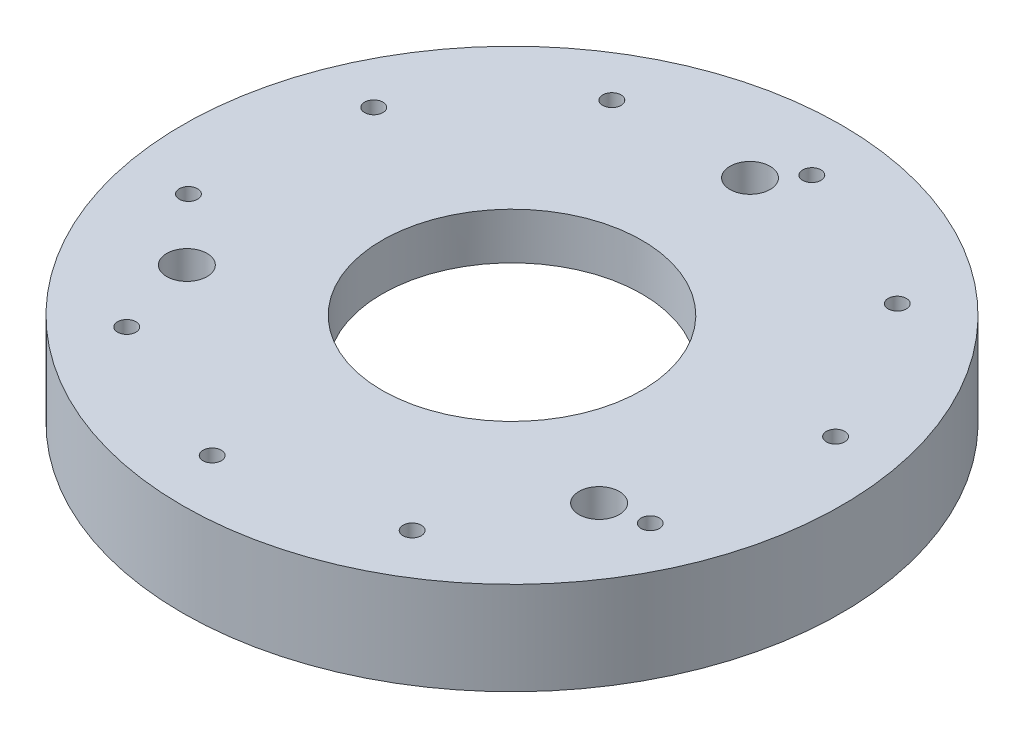
ISO-10303-21;
HEADER;
FILE_DESCRIPTION(('STEP AP214'),'2;1');
FILE_NAME('part.step','',(''),(''),'','','');
FILE_SCHEMA(('AUTOMOTIVE_DESIGN { 1 0 10303 214 1 1 1 1 }'));
ENDSEC;
DATA;
#1=APPLICATION_CONTEXT('core data for automotive mechanical design processes');
#2=APPLICATION_PROTOCOL_DEFINITION('international standard','automotive_design',2000,#1);
#3=PRODUCT_CONTEXT('',#1,'mechanical');
#4=PRODUCT('Part','Part','',(#3));
#5=PRODUCT_RELATED_PRODUCT_CATEGORY('part','',(#4));
#6=PRODUCT_DEFINITION_FORMATION('','',#4);
#7=PRODUCT_DEFINITION_CONTEXT('part definition',#1,'design');
#8=PRODUCT_DEFINITION('design','',#6,#7);
#9=PRODUCT_DEFINITION_SHAPE('','',#8);
#10=(LENGTH_UNIT() NAMED_UNIT(*) SI_UNIT(.MILLI.,.METRE.));
#11=(NAMED_UNIT(*) PLANE_ANGLE_UNIT() SI_UNIT($,.RADIAN.));
#12=(NAMED_UNIT(*) SI_UNIT($,.STERADIAN.) SOLID_ANGLE_UNIT());
#13=UNCERTAINTY_MEASURE_WITH_UNIT(LENGTH_MEASURE(1.E-05),#10,'distance_accuracy_value','');
#14=(GEOMETRIC_REPRESENTATION_CONTEXT(3) GLOBAL_UNCERTAINTY_ASSIGNED_CONTEXT((#13)) GLOBAL_UNIT_ASSIGNED_CONTEXT((#10,
#11,#12)) REPRESENTATION_CONTEXT('',''));
#15=CARTESIAN_POINT('',(0.,0.,0.));
#16=DIRECTION('',(0.,0.,1.));
#17=DIRECTION('',(1.,0.,0.));
#18=AXIS2_PLACEMENT_3D('',#15,#16,#17);
#19=CARTESIAN_POINT('',(0.,12.7,-32.5));
#20=DIRECTION('',(0.,-1.,0.));
#21=DIRECTION('',(0.,0.,-1.));
#22=AXIS2_PLACEMENT_3D('',#19,#20,#21);
#23=CYLINDRICAL_SURFACE('',#22,2.75);
#24=CARTESIAN_POINT('',(0.,12.7,-32.5));
#25=DIRECTION('',(0.,1.,0.));
#26=DIRECTION('',(0.,0.,1.));
#27=AXIS2_PLACEMENT_3D('',#24,#25,#26);
#28=CIRCLE('',#27,2.75);
#29=CARTESIAN_POINT('',(0.,12.7,-29.75));
#30=VERTEX_POINT('',#29);
#31=EDGE_CURVE('E224',#30,#30,#28,.T.);
#32=ORIENTED_EDGE('',*,*,#31,.T.);
#33=EDGE_LOOP('',(#32));
#34=FACE_BOUND('',#33,.T.);
#35=CARTESIAN_POINT('',(0.,6.35,-32.5));
#36=DIRECTION('',(0.,-1.,0.));
#37=DIRECTION('',(0.,0.,-1.));
#38=AXIS2_PLACEMENT_3D('',#35,#36,#37);
#39=CIRCLE('',#38,2.75);
#40=CARTESIAN_POINT('',(0.,6.35,-35.25));
#41=VERTEX_POINT('',#40);
#42=EDGE_CURVE('E127',#41,#41,#39,.T.);
#43=ORIENTED_EDGE('',*,*,#42,.T.);
#44=EDGE_LOOP('',(#43));
#45=FACE_BOUND('',#44,.T.);
#46=ADVANCED_FACE('F44',(#34,#45),#23,.F.);
#47=CARTESIAN_POINT('',(28.1458256229943,12.7,16.25));
#48=DIRECTION('',(0.,-1.,0.));
#49=DIRECTION('',(0.,0.,-1.));
#50=AXIS2_PLACEMENT_3D('',#47,#48,#49);
#51=CYLINDRICAL_SURFACE('',#50,2.75);
#52=CARTESIAN_POINT('',(28.1458256229943,12.7,16.25));
#53=DIRECTION('',(0.,1.,0.));
#54=DIRECTION('',(0.,0.,1.));
#55=AXIS2_PLACEMENT_3D('',#52,#53,#54);
#56=CIRCLE('',#55,2.75);
#57=CARTESIAN_POINT('',(28.1458256229943,12.7,19.));
#58=VERTEX_POINT('',#57);
#59=EDGE_CURVE('E214',#58,#58,#56,.T.);
#60=ORIENTED_EDGE('',*,*,#59,.T.);
#61=EDGE_LOOP('',(#60));
#62=FACE_BOUND('',#61,.T.);
#63=CARTESIAN_POINT('',(28.1458256229943,6.35,16.25));
#64=DIRECTION('',(0.,-1.,0.));
#65=DIRECTION('',(0.,0.,-1.));
#66=AXIS2_PLACEMENT_3D('',#63,#64,#65);
#67=CIRCLE('',#66,2.75);
#68=CARTESIAN_POINT('',(28.1458256229943,6.35,13.5));
#69=VERTEX_POINT('',#68);
#70=EDGE_CURVE('E123',#69,#69,#67,.T.);
#71=ORIENTED_EDGE('',*,*,#70,.T.);
#72=EDGE_LOOP('',(#71));
#73=FACE_BOUND('',#72,.T.);
#74=ADVANCED_FACE('F262',(#62,#73),#51,.F.);
#75=CARTESIAN_POINT('',(-28.1458256229943,12.7,16.25));
#76=DIRECTION('',(0.,-1.,0.));
#77=DIRECTION('',(0.,0.,-1.));
#78=AXIS2_PLACEMENT_3D('',#75,#76,#77);
#79=CYLINDRICAL_SURFACE('',#78,2.75);
#80=CARTESIAN_POINT('',(-28.1458256229943,12.7,16.25));
#81=DIRECTION('',(0.,1.,0.));
#82=DIRECTION('',(0.,0.,1.));
#83=AXIS2_PLACEMENT_3D('',#80,#81,#82);
#84=CIRCLE('',#83,2.75);
#85=CARTESIAN_POINT('',(-28.1458256229943,12.7,19.));
#86=VERTEX_POINT('',#85);
#87=EDGE_CURVE('E208',#86,#86,#84,.T.);
#88=ORIENTED_EDGE('',*,*,#87,.T.);
#89=EDGE_LOOP('',(#88));
#90=FACE_BOUND('',#89,.T.);
#91=CARTESIAN_POINT('',(-28.1458256229943,6.35,16.25));
#92=DIRECTION('',(0.,-1.,0.));
#93=DIRECTION('',(0.,0.,-1.));
#94=AXIS2_PLACEMENT_3D('',#91,#92,#93);
#95=CIRCLE('',#94,2.75);
#96=CARTESIAN_POINT('',(-28.1458256229943,6.35,13.5));
#97=VERTEX_POINT('',#96);
#98=EDGE_CURVE('E243',#97,#97,#95,.T.);
#99=ORIENTED_EDGE('',*,*,#98,.T.);
#100=EDGE_LOOP('',(#99));
#101=FACE_BOUND('',#100,.T.);
#102=ADVANCED_FACE('F264',(#90,#101),#79,.F.);
#103=CARTESIAN_POINT('',(0.,6.35,0.));
#104=DIRECTION('',(0.,-1.,0.));
#105=DIRECTION('',(0.,0.,-1.));
#106=AXIS2_PLACEMENT_3D('',#103,#104,#105);
#107=CYLINDRICAL_SURFACE('',#106,28.5);
#108=CARTESIAN_POINT('',(0.,6.35,0.));
#109=DIRECTION('',(0.,-1.,0.));
#110=DIRECTION('',(0.,0.,-1.));
#111=AXIS2_PLACEMENT_3D('',#108,#109,#110);
#112=CIRCLE('',#111,28.5);
#113=CARTESIAN_POINT('',(23.98200053742,6.35,15.3984950635828));
#114=VERTEX_POINT('',#113);
#115=CARTESIAN_POINT('',(-23.9820005374199,6.35,15.398495063583));
#116=VERTEX_POINT('',#115);
#117=EDGE_CURVE('E135',#114,#116,#112,.T.);
#118=ORIENTED_EDGE('',*,*,#117,.F.);
#119=DIRECTION('',(0.,-1.,0.));
#120=VECTOR('',#119,1.);
#121=CARTESIAN_POINT('',(23.98200053742,3.175,15.3984950635828));
#122=LINE('',#121,#120);
#123=CARTESIAN_POINT('',(23.98200053742,0.,15.3984950635828));
#124=VERTEX_POINT('',#123);
#125=EDGE_CURVE('E12',#114,#124,#122,.T.);
#126=ORIENTED_EDGE('',*,*,#125,.T.);
#127=CARTESIAN_POINT('',(0.,0.,0.));
#128=DIRECTION('',(0.,-1.,0.));
#129=DIRECTION('',(0.,0.,-1.));
#130=AXIS2_PLACEMENT_3D('',#127,#128,#129);
#131=CIRCLE('',#130,28.5);
#132=CARTESIAN_POINT('',(-23.9820005374199,0.,15.398495063583));
#133=VERTEX_POINT('',#132);
#134=EDGE_CURVE('E122',#124,#133,#131,.T.);
#135=ORIENTED_EDGE('',*,*,#134,.T.);
#136=DIRECTION('',(0.,-1.,0.));
#137=VECTOR('',#136,1.);
#138=CARTESIAN_POINT('',(-23.9820005374199,3.175,15.3984950635831));
#139=LINE('',#138,#137);
#140=EDGE_CURVE('E102',#133,#116,#139,.F.);
#141=ORIENTED_EDGE('',*,*,#140,.T.);
#142=EDGE_LOOP('',(#118,#126,#135,#141));
#143=FACE_BOUND('',#142,.T.);
#144=ADVANCED_FACE('F271',(#143),#107,.F.);
#145=CARTESIAN_POINT('',(1.34448763640207,0.,-28.4682692307692));
#146=VERTEX_POINT('',#145);
#147=CARTESIAN_POINT('',(25.326488173822,0.,13.0697741671864));
#148=VERTEX_POINT('',#147);
#149=EDGE_CURVE('E125',#146,#148,#131,.T.);
#150=ORIENTED_EDGE('',*,*,#149,.T.);
#151=DIRECTION('',(0.,-1.,0.));
#152=VECTOR('',#151,1.);
#153=CARTESIAN_POINT('',(25.326488173822,3.175,13.0697741671864));
#154=LINE('',#153,#152);
#155=CARTESIAN_POINT('',(25.326488173822,6.35,13.0697741671864));
#156=VERTEX_POINT('',#155);
#157=EDGE_CURVE('E52',#148,#156,#154,.F.);
#158=ORIENTED_EDGE('',*,*,#157,.T.);
#159=CARTESIAN_POINT('',(1.34448763640207,6.35,-28.4682692307692));
#160=VERTEX_POINT('',#159);
#161=EDGE_CURVE('E136',#160,#156,#112,.T.);
#162=ORIENTED_EDGE('',*,*,#161,.F.);
#163=DIRECTION('',(0.,-1.,0.));
#164=VECTOR('',#163,1.);
#165=CARTESIAN_POINT('',(1.34448763640213,3.175,-28.4682692307692));
#166=LINE('',#165,#164);
#167=EDGE_CURVE('E236',#160,#146,#166,.T.);
#168=ORIENTED_EDGE('',*,*,#167,.T.);
#169=EDGE_LOOP('',(#150,#158,#162,#168));
#170=FACE_BOUND('',#169,.T.);
#171=ADVANCED_FACE('F237',(#170),#107,.F.);
#172=CARTESIAN_POINT('',(0.,12.7,0.));
#173=DIRECTION('',(0.,1.,0.));
#174=DIRECTION('',(0.,0.,1.));
#175=AXIS2_PLACEMENT_3D('',#172,#173,#174);
#176=PLANE('',#175);
#177=CARTESIAN_POINT('',(0.,12.7,0.));
#178=DIRECTION('',(0.,1.,0.));
#179=DIRECTION('',(0.,0.,1.));
#180=AXIS2_PLACEMENT_3D('',#177,#178,#179);
#181=CIRCLE('',#180,17.75);
#182=CARTESIAN_POINT('',(0.,12.7,17.75));
#183=VERTEX_POINT('',#182);
#184=EDGE_CURVE('E140',#183,#183,#181,.T.);
#185=ORIENTED_EDGE('',*,*,#184,.F.);
#186=EDGE_LOOP('',(#185));
#187=FACE_BOUND('',#186,.T.);
#188=CARTESIAN_POINT('',(-3.8936852567201,12.7,37.0459406024682));
#189=DIRECTION('',(0.,1.,0.));
#190=DIRECTION('',(0.,0.,1.));
#191=AXIS2_PLACEMENT_3D('',#188,#189,#190);
#192=CIRCLE('',#191,1.25);
#193=CARTESIAN_POINT('',(-3.8936852567201,12.7,38.2959406024682));
#194=VERTEX_POINT('',#193);
#195=EDGE_CURVE('E156',#194,#194,#192,.T.);
#196=ORIENTED_EDGE('',*,*,#195,.F.);
#197=EDGE_LOOP('',(#196));
#198=FACE_BOUND('',#197,.T.);
#199=CARTESIAN_POINT('',(34.0295682971869,12.7,15.1509399545736));
#200=DIRECTION('',(0.,1.,0.));
#201=DIRECTION('',(0.,0.,1.));
#202=AXIS2_PLACEMENT_3D('',#199,#200,#201);
#203=CIRCLE('',#202,1.25000000000001);
#204=CARTESIAN_POINT('',(34.0295682971869,12.7,16.4009399545736));
#205=VERTEX_POINT('',#204);
#206=EDGE_CURVE('E183',#205,#205,#203,.T.);
#207=ORIENTED_EDGE('',*,*,#206,.F.);
#208=EDGE_LOOP('',(#207));
#209=FACE_BOUND('',#208,.T.);
#210=CARTESIAN_POINT('',(24.9251150868675,12.7,-27.6821447490329));
#211=DIRECTION('',(0.,1.,0.));
#212=DIRECTION('',(0.,0.,1.));
#213=AXIS2_PLACEMENT_3D('',#210,#211,#212);
#214=CIRCLE('',#213,1.25);
#215=CARTESIAN_POINT('',(24.9251150868675,12.7,-26.4321447490329));
#216=VERTEX_POINT('',#215);
#217=EDGE_CURVE('E184',#216,#216,#214,.T.);
#218=ORIENTED_EDGE('',*,*,#217,.F.);
#219=EDGE_LOOP('',(#218));
#220=FACE_BOUND('',#219,.T.);
#221=CARTESIAN_POINT('',(-18.625,12.7,-32.2594462909704));
#222=DIRECTION('',(0.,1.,0.));
#223=DIRECTION('',(0.,0.,1.));
#224=AXIS2_PLACEMENT_3D('',#221,#222,#223);
#225=CIRCLE('',#224,1.25);
#226=CARTESIAN_POINT('',(-18.625,12.7,-31.0094462909704));
#227=VERTEX_POINT('',#226);
#228=EDGE_CURVE('E194',#227,#227,#225,.T.);
#229=ORIENTED_EDGE('',*,*,#228,.F.);
#230=EDGE_LOOP('',(#229));
#231=FACE_BOUND('',#230,.T.);
#232=ORIENTED_EDGE('',*,*,#87,.F.);
#233=EDGE_LOOP('',(#232));
#234=FACE_BOUND('',#233,.T.);
#235=CARTESIAN_POINT('',(-36.4359981273343,12.7,7.74471048296152));
#236=DIRECTION('',(0.,1.,0.));
#237=DIRECTION('',(0.,0.,1.));
#238=AXIS2_PLACEMENT_3D('',#235,#236,#237);
#239=CIRCLE('',#238,1.25000000000001);
#240=CARTESIAN_POINT('',(-36.4359981273343,12.7,8.99471048296152));
#241=VERTEX_POINT('',#240);
#242=EDGE_CURVE('E220',#241,#241,#239,.T.);
#243=ORIENTED_EDGE('',*,*,#242,.F.);
#244=EDGE_LOOP('',(#243));
#245=FACE_BOUND('',#244,.T.);
#246=CARTESIAN_POINT('',(0.,12.7,0.));
#247=DIRECTION('',(0.,1.,0.));
#248=DIRECTION('',(0.,0.,1.));
#249=AXIS2_PLACEMENT_3D('',#246,#247,#248);
#250=CIRCLE('',#249,45.);
#251=CARTESIAN_POINT('',(0.,12.7,45.));
#252=VERTEX_POINT('',#251);
#253=EDGE_CURVE('E226',#252,#252,#250,.T.);
#254=ORIENTED_EDGE('',*,*,#253,.T.);
#255=EDGE_LOOP('',(#254));
#256=FACE_BOUND('',#255,.T.);
#257=ORIENTED_EDGE('',*,*,#31,.F.);
#258=EDGE_LOOP('',(#257));
#259=FACE_BOUND('',#258,.T.);
#260=ORIENTED_EDGE('',*,*,#59,.F.);
#261=EDGE_LOOP('',(#260));
#262=FACE_BOUND('',#261,.T.);
#263=CARTESIAN_POINT('',(-34.0295682971869,12.7,-15.1509399545736));
#264=DIRECTION('',(0.,1.,0.));
#265=DIRECTION('',(0.,0.,1.));
#266=AXIS2_PLACEMENT_3D('',#263,#264,#265);
#267=CIRCLE('',#266,1.25000000000001);
#268=CARTESIAN_POINT('',(-34.0295682971869,12.7,-13.9009399545736));
#269=VERTEX_POINT('',#268);
#270=EDGE_CURVE('E204',#269,#269,#267,.T.);
#271=ORIENTED_EDGE('',*,*,#270,.F.);
#272=EDGE_LOOP('',(#271));
#273=FACE_BOUND('',#272,.T.);
#274=CARTESIAN_POINT('',(3.8936852567201,12.7,-37.0459406024682));
#275=DIRECTION('',(0.,1.,0.));
#276=DIRECTION('',(0.,0.,1.));
#277=AXIS2_PLACEMENT_3D('',#274,#275,#276);
#278=CIRCLE('',#277,1.25);
#279=CARTESIAN_POINT('',(3.8936852567201,12.7,-35.7959406024682));
#280=VERTEX_POINT('',#279);
#281=EDGE_CURVE('E203',#280,#280,#278,.T.);
#282=ORIENTED_EDGE('',*,*,#281,.F.);
#283=EDGE_LOOP('',(#282));
#284=FACE_BOUND('',#283,.T.);
#285=CARTESIAN_POINT('',(36.4359981273343,12.7,-7.74471048296153));
#286=DIRECTION('',(0.,1.,0.));
#287=DIRECTION('',(0.,0.,1.));
#288=AXIS2_PLACEMENT_3D('',#285,#286,#287);
#289=CIRCLE('',#288,1.25);
#290=CARTESIAN_POINT('',(36.4359981273343,12.7,-6.49471048296152));
#291=VERTEX_POINT('',#290);
#292=EDGE_CURVE('E174',#291,#291,#289,.T.);
#293=ORIENTED_EDGE('',*,*,#292,.F.);
#294=EDGE_LOOP('',(#293));
#295=FACE_BOUND('',#294,.T.);
#296=CARTESIAN_POINT('',(18.625,12.7,32.2594462909704));
#297=DIRECTION('',(0.,1.,0.));
#298=DIRECTION('',(0.,0.,1.));
#299=AXIS2_PLACEMENT_3D('',#296,#297,#298);
#300=CIRCLE('',#299,1.25);
#301=CARTESIAN_POINT('',(18.625,12.7,33.5094462909704));
#302=VERTEX_POINT('',#301);
#303=EDGE_CURVE('E164',#302,#302,#300,.T.);
#304=ORIENTED_EDGE('',*,*,#303,.F.);
#305=EDGE_LOOP('',(#304));
#306=FACE_BOUND('',#305,.T.);
#307=CARTESIAN_POINT('',(-24.9251150868675,12.7,27.6821447490329));
#308=DIRECTION('',(0.,1.,0.));
#309=DIRECTION('',(0.,0.,1.));
#310=AXIS2_PLACEMENT_3D('',#307,#308,#309);
#311=CIRCLE('',#310,1.25);
#312=CARTESIAN_POINT('',(-24.9251150868675,12.7,28.9321447490329));
#313=VERTEX_POINT('',#312);
#314=EDGE_CURVE('E147',#313,#313,#311,.T.);
#315=ORIENTED_EDGE('',*,*,#314,.F.);
#316=EDGE_LOOP('',(#315));
#317=FACE_BOUND('',#316,.T.);
#318=ADVANCED_FACE('F283',(#187,#198,#209,#220,#231,#234,#245,#256,#259,#262,#273,#284,#295,
#306,#317),#176,.T.);
#319=CARTESIAN_POINT('',(0.,0.,0.));
#320=DIRECTION('',(0.,1.,0.));
#321=DIRECTION('',(0.,0.,1.));
#322=AXIS2_PLACEMENT_3D('',#319,#320,#321);
#323=PLANE('',#322);
#324=ORIENTED_EDGE('',*,*,#134,.F.);
#325=CARTESIAN_POINT('',(28.1458256229943,0.,16.25));
#326=DIRECTION('',(0.,-1.,0.));
#327=DIRECTION('',(0.,0.,-1.));
#328=AXIS2_PLACEMENT_3D('',#325,#326,#327);
#329=CIRCLE('',#328,4.25);
#330=EDGE_CURVE('E241',#148,#124,#329,.T.);
#331=ORIENTED_EDGE('',*,*,#330,.F.);
#332=ORIENTED_EDGE('',*,*,#149,.F.);
#333=CARTESIAN_POINT('',(0.,0.,-32.5));
#334=DIRECTION('',(0.,-1.,0.));
#335=DIRECTION('',(0.,0.,-1.));
#336=AXIS2_PLACEMENT_3D('',#333,#334,#335);
#337=CIRCLE('',#336,4.25000000000003);
#338=CARTESIAN_POINT('',(-1.34448763640202,0.,-28.4682692307692));
#339=VERTEX_POINT('',#338);
#340=EDGE_CURVE('E121',#339,#146,#337,.T.);
#341=ORIENTED_EDGE('',*,*,#340,.F.);
#342=CARTESIAN_POINT('',(-25.3264881738221,0.,13.0697741671862));
#343=VERTEX_POINT('',#342);
#344=EDGE_CURVE('E113',#343,#339,#131,.T.);
#345=ORIENTED_EDGE('',*,*,#344,.F.);
#346=CARTESIAN_POINT('',(-28.1458256229943,0.,16.25));
#347=DIRECTION('',(0.,-1.,0.));
#348=DIRECTION('',(0.,0.,-1.));
#349=AXIS2_PLACEMENT_3D('',#346,#347,#348);
#350=CIRCLE('',#349,4.25000000000007);
#351=EDGE_CURVE('E96',#133,#343,#350,.T.);
#352=ORIENTED_EDGE('',*,*,#351,.F.);
#353=EDGE_LOOP('',(#324,#331,#332,#341,#345,#352));
#354=FACE_BOUND('',#353,.T.);
#355=CARTESIAN_POINT('',(0.,0.,0.));
#356=DIRECTION('',(0.,1.,0.));
#357=DIRECTION('',(0.,0.,1.));
#358=AXIS2_PLACEMENT_3D('',#355,#356,#357);
#359=CIRCLE('',#358,45.);
#360=CARTESIAN_POINT('',(0.,0.,45.));
#361=VERTEX_POINT('',#360);
#362=EDGE_CURVE('E230',#361,#361,#359,.T.);
#363=ORIENTED_EDGE('',*,*,#362,.F.);
#364=EDGE_LOOP('',(#363));
#365=FACE_BOUND('',#364,.T.);
#366=CARTESIAN_POINT('',(-36.4359981273343,0.,7.74471048296152));
#367=DIRECTION('',(0.,1.,0.));
#368=DIRECTION('',(0.,0.,1.));
#369=AXIS2_PLACEMENT_3D('',#366,#367,#368);
#370=CIRCLE('',#369,1.25000000000001);
#371=CARTESIAN_POINT('',(-36.4359981273343,0.,8.99471048296152));
#372=VERTEX_POINT('',#371);
#373=EDGE_CURVE('E218',#372,#372,#370,.T.);
#374=ORIENTED_EDGE('',*,*,#373,.T.);
#375=EDGE_LOOP('',(#374));
#376=FACE_BOUND('',#375,.T.);
#377=CARTESIAN_POINT('',(-34.0295682971869,0.,-15.1509399545736));
#378=DIRECTION('',(0.,1.,0.));
#379=DIRECTION('',(0.,0.,1.));
#380=AXIS2_PLACEMENT_3D('',#377,#378,#379);
#381=CIRCLE('',#380,1.25000000000001);
#382=CARTESIAN_POINT('',(-34.0295682971869,0.,-13.9009399545736));
#383=VERTEX_POINT('',#382);
#384=EDGE_CURVE('E199',#383,#383,#381,.T.);
#385=ORIENTED_EDGE('',*,*,#384,.T.);
#386=EDGE_LOOP('',(#385));
#387=FACE_BOUND('',#386,.T.);
#388=CARTESIAN_POINT('',(-18.625,0.,-32.2594462909704));
#389=DIRECTION('',(0.,1.,0.));
#390=DIRECTION('',(0.,0.,1.));
#391=AXIS2_PLACEMENT_3D('',#388,#389,#390);
#392=CIRCLE('',#391,1.25);
#393=CARTESIAN_POINT('',(-18.625,0.,-31.0094462909704));
#394=VERTEX_POINT('',#393);
#395=EDGE_CURVE('E200',#394,#394,#392,.T.);
#396=ORIENTED_EDGE('',*,*,#395,.T.);
#397=EDGE_LOOP('',(#396));
#398=FACE_BOUND('',#397,.T.);
#399=CARTESIAN_POINT('',(3.8936852567201,0.,-37.0459406024682));
#400=DIRECTION('',(0.,1.,0.));
#401=DIRECTION('',(0.,0.,1.));
#402=AXIS2_PLACEMENT_3D('',#399,#400,#401);
#403=CIRCLE('',#402,1.25);
#404=CARTESIAN_POINT('',(3.8936852567201,0.,-35.7959406024682));
#405=VERTEX_POINT('',#404);
#406=EDGE_CURVE('E188',#405,#405,#403,.T.);
#407=ORIENTED_EDGE('',*,*,#406,.T.);
#408=EDGE_LOOP('',(#407));
#409=FACE_BOUND('',#408,.T.);
#410=CARTESIAN_POINT('',(24.9251150868675,0.,-27.6821447490329));
#411=DIRECTION('',(0.,1.,0.));
#412=DIRECTION('',(0.,0.,1.));
#413=AXIS2_PLACEMENT_3D('',#410,#411,#412);
#414=CIRCLE('',#413,1.25);
#415=CARTESIAN_POINT('',(24.9251150868675,0.,-26.4321447490329));
#416=VERTEX_POINT('',#415);
#417=EDGE_CURVE('E179',#416,#416,#414,.T.);
#418=ORIENTED_EDGE('',*,*,#417,.T.);
#419=EDGE_LOOP('',(#418));
#420=FACE_BOUND('',#419,.T.);
#421=CARTESIAN_POINT('',(36.4359981273343,0.,-7.74471048296153));
#422=DIRECTION('',(0.,1.,0.));
#423=DIRECTION('',(0.,0.,1.));
#424=AXIS2_PLACEMENT_3D('',#421,#422,#423);
#425=CIRCLE('',#424,1.25);
#426=CARTESIAN_POINT('',(36.4359981273343,0.,-6.49471048296152));
#427=VERTEX_POINT('',#426);
#428=EDGE_CURVE('E180',#427,#427,#425,.T.);
#429=ORIENTED_EDGE('',*,*,#428,.T.);
#430=EDGE_LOOP('',(#429));
#431=FACE_BOUND('',#430,.T.);
#432=CARTESIAN_POINT('',(34.0295682971869,0.,15.1509399545736));
#433=DIRECTION('',(0.,1.,0.));
#434=DIRECTION('',(0.,0.,1.));
#435=AXIS2_PLACEMENT_3D('',#432,#433,#434);
#436=CIRCLE('',#435,1.25000000000001);
#437=CARTESIAN_POINT('',(34.0295682971869,0.,16.4009399545736));
#438=VERTEX_POINT('',#437);
#439=EDGE_CURVE('E168',#438,#438,#436,.T.);
#440=ORIENTED_EDGE('',*,*,#439,.T.);
#441=EDGE_LOOP('',(#440));
#442=FACE_BOUND('',#441,.T.);
#443=CARTESIAN_POINT('',(18.625,0.,32.2594462909704));
#444=DIRECTION('',(0.,1.,0.));
#445=DIRECTION('',(0.,0.,1.));
#446=AXIS2_PLACEMENT_3D('',#443,#444,#445);
#447=CIRCLE('',#446,1.25);
#448=CARTESIAN_POINT('',(18.625,0.,33.5094462909704));
#449=VERTEX_POINT('',#448);
#450=EDGE_CURVE('E160',#449,#449,#447,.T.);
#451=ORIENTED_EDGE('',*,*,#450,.T.);
#452=EDGE_LOOP('',(#451));
#453=FACE_BOUND('',#452,.T.);
#454=CARTESIAN_POINT('',(-3.8936852567201,0.,37.0459406024682));
#455=DIRECTION('',(0.,1.,0.));
#456=DIRECTION('',(0.,0.,1.));
#457=AXIS2_PLACEMENT_3D('',#454,#455,#456);
#458=CIRCLE('',#457,1.25);
#459=CARTESIAN_POINT('',(-3.8936852567201,0.,38.2959406024682));
#460=VERTEX_POINT('',#459);
#461=EDGE_CURVE('E161',#460,#460,#458,.T.);
#462=ORIENTED_EDGE('',*,*,#461,.T.);
#463=EDGE_LOOP('',(#462));
#464=FACE_BOUND('',#463,.T.);
#465=CARTESIAN_POINT('',(-24.9251150868675,0.,27.6821447490329));
#466=DIRECTION('',(0.,1.,0.));
#467=DIRECTION('',(0.,0.,1.));
#468=AXIS2_PLACEMENT_3D('',#465,#466,#467);
#469=CIRCLE('',#468,1.25);
#470=CARTESIAN_POINT('',(-24.9251150868675,0.,28.9321447490329));
#471=VERTEX_POINT('',#470);
#472=EDGE_CURVE('E144',#471,#471,#469,.T.);
#473=ORIENTED_EDGE('',*,*,#472,.T.);
#474=EDGE_LOOP('',(#473));
#475=FACE_BOUND('',#474,.T.);
#476=ADVANCED_FACE('F118',(#354,#365,#376,#387,#398,#409,#420,#431,#442,#453,#464,#475),#323,.F.);
#477=CARTESIAN_POINT('',(0.,12.7,0.));
#478=DIRECTION('',(0.,-1.,0.));
#479=DIRECTION('',(0.,0.,-1.));
#480=AXIS2_PLACEMENT_3D('',#477,#478,#479);
#481=CYLINDRICAL_SURFACE('',#480,45.);
#482=ORIENTED_EDGE('',*,*,#253,.F.);
#483=EDGE_LOOP('',(#482));
#484=FACE_BOUND('',#483,.T.);
#485=ORIENTED_EDGE('',*,*,#362,.T.);
#486=EDGE_LOOP('',(#485));
#487=FACE_BOUND('',#486,.T.);
#488=ADVANCED_FACE('F46',(#484,#487),#481,.T.);
#489=CARTESIAN_POINT('',(-36.4359981273343,12.7,7.74471048296152));
#490=DIRECTION('',(0.,-1.,0.));
#491=DIRECTION('',(0.,0.,-1.));
#492=AXIS2_PLACEMENT_3D('',#489,#490,#491);
#493=CYLINDRICAL_SURFACE('',#492,1.25000000000001);
#494=ORIENTED_EDGE('',*,*,#242,.T.);
#495=EDGE_LOOP('',(#494));
#496=FACE_BOUND('',#495,.T.);
#497=ORIENTED_EDGE('',*,*,#373,.F.);
#498=EDGE_LOOP('',(#497));
#499=FACE_BOUND('',#498,.T.);
#500=ADVANCED_FACE('F278',(#496,#499),#493,.F.);
#501=CARTESIAN_POINT('',(-34.0295682971869,12.7,-15.1509399545736));
#502=DIRECTION('',(0.,-1.,0.));
#503=DIRECTION('',(0.,0.,-1.));
#504=AXIS2_PLACEMENT_3D('',#501,#502,#503);
#505=CYLINDRICAL_SURFACE('',#504,1.25000000000001);
#506=ORIENTED_EDGE('',*,*,#270,.T.);
#507=EDGE_LOOP('',(#506));
#508=FACE_BOUND('',#507,.T.);
#509=ORIENTED_EDGE('',*,*,#384,.F.);
#510=EDGE_LOOP('',(#509));
#511=FACE_BOUND('',#510,.T.);
#512=ADVANCED_FACE('F280',(#508,#511),#505,.F.);
#513=CARTESIAN_POINT('',(-18.625,12.7,-32.2594462909704));
#514=DIRECTION('',(0.,-1.,0.));
#515=DIRECTION('',(0.,0.,-1.));
#516=AXIS2_PLACEMENT_3D('',#513,#514,#515);
#517=CYLINDRICAL_SURFACE('',#516,1.25);
#518=ORIENTED_EDGE('',*,*,#228,.T.);
#519=EDGE_LOOP('',(#518));
#520=FACE_BOUND('',#519,.T.);
#521=ORIENTED_EDGE('',*,*,#395,.F.);
#522=EDGE_LOOP('',(#521));
#523=FACE_BOUND('',#522,.T.);
#524=ADVANCED_FACE('F362',(#520,#523),#517,.F.);
#525=CARTESIAN_POINT('',(3.8936852567201,12.7,-37.0459406024682));
#526=DIRECTION('',(0.,-1.,0.));
#527=DIRECTION('',(0.,0.,-1.));
#528=AXIS2_PLACEMENT_3D('',#525,#526,#527);
#529=CYLINDRICAL_SURFACE('',#528,1.25);
#530=ORIENTED_EDGE('',*,*,#281,.T.);
#531=EDGE_LOOP('',(#530));
#532=FACE_BOUND('',#531,.T.);
#533=ORIENTED_EDGE('',*,*,#406,.F.);
#534=EDGE_LOOP('',(#533));
#535=FACE_BOUND('',#534,.T.);
#536=ADVANCED_FACE('F358',(#532,#535),#529,.F.);
#537=CARTESIAN_POINT('',(24.9251150868675,12.7,-27.6821447490329));
#538=DIRECTION('',(0.,-1.,0.));
#539=DIRECTION('',(0.,0.,-1.));
#540=AXIS2_PLACEMENT_3D('',#537,#538,#539);
#541=CYLINDRICAL_SURFACE('',#540,1.25);
#542=ORIENTED_EDGE('',*,*,#217,.T.);
#543=EDGE_LOOP('',(#542));
#544=FACE_BOUND('',#543,.T.);
#545=ORIENTED_EDGE('',*,*,#417,.F.);
#546=EDGE_LOOP('',(#545));
#547=FACE_BOUND('',#546,.T.);
#548=ADVANCED_FACE('F354',(#544,#547),#541,.F.);
#549=CARTESIAN_POINT('',(36.4359981273343,12.7,-7.74471048296153));
#550=DIRECTION('',(0.,-1.,0.));
#551=DIRECTION('',(0.,0.,-1.));
#552=AXIS2_PLACEMENT_3D('',#549,#550,#551);
#553=CYLINDRICAL_SURFACE('',#552,1.25);
#554=ORIENTED_EDGE('',*,*,#292,.T.);
#555=EDGE_LOOP('',(#554));
#556=FACE_BOUND('',#555,.T.);
#557=ORIENTED_EDGE('',*,*,#428,.F.);
#558=EDGE_LOOP('',(#557));
#559=FACE_BOUND('',#558,.T.);
#560=ADVANCED_FACE('F350',(#556,#559),#553,.F.);
#561=CARTESIAN_POINT('',(34.0295682971869,12.7,15.1509399545736));
#562=DIRECTION('',(0.,-1.,0.));
#563=DIRECTION('',(0.,0.,-1.));
#564=AXIS2_PLACEMENT_3D('',#561,#562,#563);
#565=CYLINDRICAL_SURFACE('',#564,1.25000000000001);
#566=ORIENTED_EDGE('',*,*,#206,.T.);
#567=EDGE_LOOP('',(#566));
#568=FACE_BOUND('',#567,.T.);
#569=ORIENTED_EDGE('',*,*,#439,.F.);
#570=EDGE_LOOP('',(#569));
#571=FACE_BOUND('',#570,.T.);
#572=ADVANCED_FACE('F346',(#568,#571),#565,.F.);
#573=CARTESIAN_POINT('',(18.625,12.7,32.2594462909704));
#574=DIRECTION('',(0.,-1.,0.));
#575=DIRECTION('',(0.,0.,-1.));
#576=AXIS2_PLACEMENT_3D('',#573,#574,#575);
#577=CYLINDRICAL_SURFACE('',#576,1.25);
#578=ORIENTED_EDGE('',*,*,#303,.T.);
#579=EDGE_LOOP('',(#578));
#580=FACE_BOUND('',#579,.T.);
#581=ORIENTED_EDGE('',*,*,#450,.F.);
#582=EDGE_LOOP('',(#581));
#583=FACE_BOUND('',#582,.T.);
#584=ADVANCED_FACE('F339',(#580,#583),#577,.F.);
#585=CARTESIAN_POINT('',(-3.8936852567201,12.7,37.0459406024682));
#586=DIRECTION('',(0.,-1.,0.));
#587=DIRECTION('',(0.,0.,-1.));
#588=AXIS2_PLACEMENT_3D('',#585,#586,#587);
#589=CYLINDRICAL_SURFACE('',#588,1.25);
#590=ORIENTED_EDGE('',*,*,#195,.T.);
#591=EDGE_LOOP('',(#590));
#592=FACE_BOUND('',#591,.T.);
#593=ORIENTED_EDGE('',*,*,#461,.F.);
#594=EDGE_LOOP('',(#593));
#595=FACE_BOUND('',#594,.T.);
#596=ADVANCED_FACE('F331',(#592,#595),#589,.F.);
#597=CARTESIAN_POINT('',(-24.9251150868675,12.7,27.6821447490329));
#598=DIRECTION('',(0.,-1.,0.));
#599=DIRECTION('',(0.,0.,-1.));
#600=AXIS2_PLACEMENT_3D('',#597,#598,#599);
#601=CYLINDRICAL_SURFACE('',#600,1.25);
#602=ORIENTED_EDGE('',*,*,#314,.T.);
#603=EDGE_LOOP('',(#602));
#604=FACE_BOUND('',#603,.T.);
#605=ORIENTED_EDGE('',*,*,#472,.F.);
#606=EDGE_LOOP('',(#605));
#607=FACE_BOUND('',#606,.T.);
#608=ADVANCED_FACE('F328',(#604,#607),#601,.F.);
#609=CARTESIAN_POINT('',(0.,6.35,0.));
#610=DIRECTION('',(0.,1.,0.));
#611=DIRECTION('',(0.,0.,1.));
#612=AXIS2_PLACEMENT_3D('',#609,#610,#611);
#613=CYLINDRICAL_SURFACE('',#612,17.75);
#614=CARTESIAN_POINT('',(0.,6.35,0.));
#615=DIRECTION('',(0.,-1.,0.));
#616=DIRECTION('',(0.,0.,-1.));
#617=AXIS2_PLACEMENT_3D('',#614,#615,#616);
#618=CIRCLE('',#617,17.75);
#619=CARTESIAN_POINT('',(0.,6.35,-17.75));
#620=VERTEX_POINT('',#619);
#621=EDGE_CURVE('E137',#620,#620,#618,.F.);
#622=ORIENTED_EDGE('',*,*,#621,.F.);
#623=EDGE_LOOP('',(#622));
#624=FACE_BOUND('',#623,.T.);
#625=ORIENTED_EDGE('',*,*,#184,.T.);
#626=EDGE_LOOP('',(#625));
#627=FACE_BOUND('',#626,.T.);
#628=ADVANCED_FACE('F258',(#624,#627),#613,.F.);
#629=CARTESIAN_POINT('',(0.,6.35,0.));
#630=DIRECTION('',(0.,-1.,0.));
#631=DIRECTION('',(0.,0.,-1.));
#632=AXIS2_PLACEMENT_3D('',#629,#630,#631);
#633=PLANE('',#632);
#634=ORIENTED_EDGE('',*,*,#161,.T.);
#635=CARTESIAN_POINT('',(28.1458256229943,6.35,16.25));
#636=DIRECTION('',(0.,-1.,0.));
#637=DIRECTION('',(0.,0.,-1.));
#638=AXIS2_PLACEMENT_3D('',#635,#636,#637);
#639=CIRCLE('',#638,4.25);
#640=EDGE_CURVE('E65',#156,#114,#639,.T.);
#641=ORIENTED_EDGE('',*,*,#640,.T.);
#642=ORIENTED_EDGE('',*,*,#117,.T.);
#643=CARTESIAN_POINT('',(-28.1458256229943,6.35,16.25));
#644=DIRECTION('',(0.,-1.,0.));
#645=DIRECTION('',(0.,0.,-1.));
#646=AXIS2_PLACEMENT_3D('',#643,#644,#645);
#647=CIRCLE('',#646,4.25000000000007);
#648=CARTESIAN_POINT('',(-25.3264881738221,6.35,13.0697741671862));
#649=VERTEX_POINT('',#648);
#650=EDGE_CURVE('E59',#116,#649,#647,.T.);
#651=ORIENTED_EDGE('',*,*,#650,.T.);
#652=CARTESIAN_POINT('',(-1.34448763640202,6.35,-28.4682692307692));
#653=VERTEX_POINT('',#652);
#654=EDGE_CURVE('E114',#649,#653,#112,.T.);
#655=ORIENTED_EDGE('',*,*,#654,.T.);
#656=CARTESIAN_POINT('',(0.,6.35,-32.5));
#657=DIRECTION('',(0.,-1.,0.));
#658=DIRECTION('',(0.,0.,-1.));
#659=AXIS2_PLACEMENT_3D('',#656,#657,#658);
#660=CIRCLE('',#659,4.25000000000003);
#661=EDGE_CURVE('E107',#653,#160,#660,.T.);
#662=ORIENTED_EDGE('',*,*,#661,.T.);
#663=EDGE_LOOP('',(#634,#641,#642,#651,#655,#662));
#664=FACE_BOUND('',#663,.T.);
#665=ORIENTED_EDGE('',*,*,#621,.T.);
#666=EDGE_LOOP('',(#665));
#667=FACE_BOUND('',#666,.T.);
#668=ORIENTED_EDGE('',*,*,#98,.F.);
#669=EDGE_LOOP('',(#668));
#670=FACE_BOUND('',#669,.T.);
#671=ORIENTED_EDGE('',*,*,#42,.F.);
#672=EDGE_LOOP('',(#671));
#673=FACE_BOUND('',#672,.T.);
#674=ORIENTED_EDGE('',*,*,#70,.F.);
#675=EDGE_LOOP('',(#674));
#676=FACE_BOUND('',#675,.T.);
#677=ADVANCED_FACE('F255',(#664,#667,#670,#673,#676),#633,.T.);
#678=ORIENTED_EDGE('',*,*,#344,.T.);
#679=DIRECTION('',(0.,-1.,0.));
#680=VECTOR('',#679,1.);
#681=CARTESIAN_POINT('',(-1.34448763640208,3.175,-28.4682692307693));
#682=LINE('',#681,#680);
#683=EDGE_CURVE('E115',#339,#653,#682,.F.);
#684=ORIENTED_EDGE('',*,*,#683,.T.);
#685=ORIENTED_EDGE('',*,*,#654,.F.);
#686=DIRECTION('',(0.,-1.,0.));
#687=VECTOR('',#686,1.);
#688=CARTESIAN_POINT('',(-25.3264881738221,3.175,13.0697741671862));
#689=LINE('',#688,#687);
#690=EDGE_CURVE('E99',#649,#343,#689,.T.);
#691=ORIENTED_EDGE('',*,*,#690,.T.);
#692=EDGE_LOOP('',(#678,#684,#685,#691));
#693=FACE_BOUND('',#692,.T.);
#694=ADVANCED_FACE('F111',(#693),#107,.F.);
#695=CARTESIAN_POINT('',(-28.1458256229943,6.35,16.25));
#696=DIRECTION('',(0.,-1.,0.));
#697=DIRECTION('',(0.,0.,-1.));
#698=AXIS2_PLACEMENT_3D('',#695,#696,#697);
#699=CYLINDRICAL_SURFACE('',#698,4.25000000000007);
#700=ORIENTED_EDGE('',*,*,#650,.F.);
#701=ORIENTED_EDGE('',*,*,#140,.F.);
#702=ORIENTED_EDGE('',*,*,#351,.T.);
#703=ORIENTED_EDGE('',*,*,#690,.F.);
#704=EDGE_LOOP('',(#700,#701,#702,#703));
#705=FACE_BOUND('',#704,.T.);
#706=ADVANCED_FACE('F98',(#705),#699,.F.);
#707=CARTESIAN_POINT('',(0.,6.35,-32.5));
#708=DIRECTION('',(0.,-1.,0.));
#709=DIRECTION('',(0.,0.,-1.));
#710=AXIS2_PLACEMENT_3D('',#707,#708,#709);
#711=CYLINDRICAL_SURFACE('',#710,4.25000000000003);
#712=ORIENTED_EDGE('',*,*,#661,.F.);
#713=ORIENTED_EDGE('',*,*,#683,.F.);
#714=ORIENTED_EDGE('',*,*,#340,.T.);
#715=ORIENTED_EDGE('',*,*,#167,.F.);
#716=EDGE_LOOP('',(#712,#713,#714,#715));
#717=FACE_BOUND('',#716,.T.);
#718=ADVANCED_FACE('F483',(#717),#711,.F.);
#719=CARTESIAN_POINT('',(28.1458256229943,6.35,16.25));
#720=DIRECTION('',(0.,-1.,0.));
#721=DIRECTION('',(0.,0.,-1.));
#722=AXIS2_PLACEMENT_3D('',#719,#720,#721);
#723=CYLINDRICAL_SURFACE('',#722,4.25);
#724=ORIENTED_EDGE('',*,*,#640,.F.);
#725=ORIENTED_EDGE('',*,*,#157,.F.);
#726=ORIENTED_EDGE('',*,*,#330,.T.);
#727=ORIENTED_EDGE('',*,*,#125,.F.);
#728=EDGE_LOOP('',(#724,#725,#726,#727));
#729=FACE_BOUND('',#728,.T.);
#730=ADVANCED_FACE('F240',(#729),#723,.F.);
#731=CLOSED_SHELL('',(#46,#74,#102,#144,#171,#318,#476,#488,#500,#512,#524,#536,#548,#560,#572,
#584,#596,#608,#628,#677,#694,#706,#718,#730));
#732=MANIFOLD_SOLID_BREP('B2',#731);
#733=ADVANCED_BREP_SHAPE_REPRESENTATION('',(#18,#732),#14);
#734=SHAPE_DEFINITION_REPRESENTATION(#9,#733);
ENDSEC;
END-ISO-10303-21;
